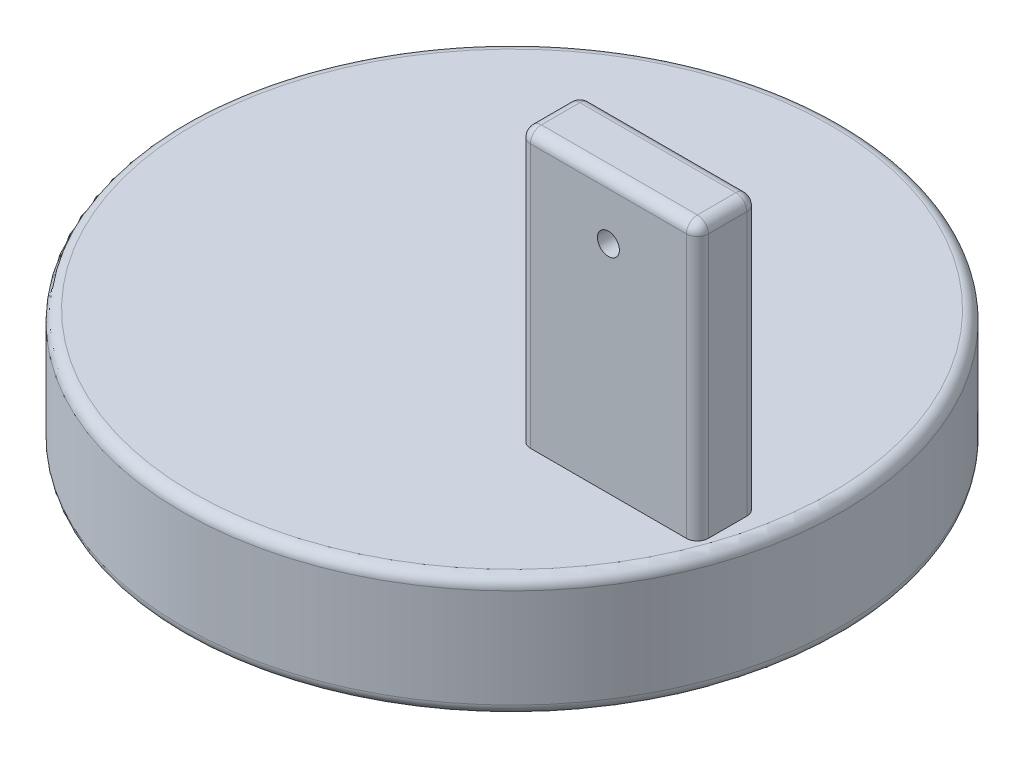
ISO-10303-21;
HEADER;
FILE_DESCRIPTION(('STEP AP214'),'2;1');
FILE_NAME('part.step','',(''),(''),'','','');
FILE_SCHEMA(('AUTOMOTIVE_DESIGN { 1 0 10303 214 1 1 1 1 }'));
ENDSEC;
DATA;
#1=APPLICATION_CONTEXT('core data for automotive mechanical design processes');
#2=APPLICATION_PROTOCOL_DEFINITION('international standard','automotive_design',2000,#1);
#3=PRODUCT_CONTEXT('',#1,'mechanical');
#4=PRODUCT('Part','Part','',(#3));
#5=PRODUCT_RELATED_PRODUCT_CATEGORY('part','',(#4));
#6=PRODUCT_DEFINITION_FORMATION('','',#4);
#7=PRODUCT_DEFINITION_CONTEXT('part definition',#1,'design');
#8=PRODUCT_DEFINITION('design','',#6,#7);
#9=PRODUCT_DEFINITION_SHAPE('','',#8);
#10=(LENGTH_UNIT() NAMED_UNIT(*) SI_UNIT(.MILLI.,.METRE.));
#11=(NAMED_UNIT(*) PLANE_ANGLE_UNIT() SI_UNIT($,.RADIAN.));
#12=(NAMED_UNIT(*) SI_UNIT($,.STERADIAN.) SOLID_ANGLE_UNIT());
#13=UNCERTAINTY_MEASURE_WITH_UNIT(LENGTH_MEASURE(1.E-05),#10,'distance_accuracy_value','');
#14=(GEOMETRIC_REPRESENTATION_CONTEXT(3) GLOBAL_UNCERTAINTY_ASSIGNED_CONTEXT((#13)) GLOBAL_UNIT_ASSIGNED_CONTEXT((#10,
#11,#12)) REPRESENTATION_CONTEXT('',''));
#15=CARTESIAN_POINT('',(0.,0.,0.));
#16=DIRECTION('',(0.,0.,1.));
#17=DIRECTION('',(1.,0.,0.));
#18=AXIS2_PLACEMENT_3D('',#15,#16,#17);
#19=CARTESIAN_POINT('',(0.,11.,0.));
#20=DIRECTION('',(0.,1.,0.));
#21=DIRECTION('',(0.,0.,1.));
#22=AXIS2_PLACEMENT_3D('',#19,#20,#21);
#23=PLANE('',#22);
#24=CARTESIAN_POINT('',(0.,11.,0.));
#25=DIRECTION('',(0.,1.,0.));
#26=DIRECTION('',(0.,0.,1.));
#27=AXIS2_PLACEMENT_3D('',#24,#25,#26);
#28=CIRCLE('',#27,29.);
#29=CARTESIAN_POINT('',(0.,11.,29.));
#30=VERTEX_POINT('',#29);
#31=EDGE_CURVE('E225',#30,#30,#28,.T.);
#32=ORIENTED_EDGE('',*,*,#31,.T.);
#33=EDGE_LOOP('',(#32));
#34=FACE_BOUND('',#33,.T.);
#35=DIRECTION('',(0.,0.,-1.));
#36=VECTOR('',#35,1.);
#37=CARTESIAN_POINT('',(10.8,11.,10.13));
#38=LINE('',#37,#36);
#39=CARTESIAN_POINT('',(10.8,11.,9.13));
#40=VERTEX_POINT('',#39);
#41=CARTESIAN_POINT('',(10.8,11.,5.63));
#42=VERTEX_POINT('',#41);
#43=EDGE_CURVE('E121',#40,#42,#38,.T.);
#44=ORIENTED_EDGE('',*,*,#43,.T.);
#45=CARTESIAN_POINT('',(11.8,11.,5.63));
#46=DIRECTION('',(0.,1.,0.));
#47=DIRECTION('',(0.,0.,1.));
#48=AXIS2_PLACEMENT_3D('',#45,#46,#47);
#49=CIRCLE('',#48,1.);
#50=CARTESIAN_POINT('',(11.8,11.,4.63));
#51=VERTEX_POINT('',#50);
#52=EDGE_CURVE('E116',#42,#51,#49,.F.);
#53=ORIENTED_EDGE('',*,*,#52,.T.);
#54=DIRECTION('',(1.,0.,0.));
#55=VECTOR('',#54,1.);
#56=CARTESIAN_POINT('',(27.,11.,4.63));
#57=LINE('',#56,#55);
#58=CARTESIAN_POINT('',(26.,11.,4.63));
#59=VERTEX_POINT('',#58);
#60=EDGE_CURVE('E118',#51,#59,#57,.T.);
#61=ORIENTED_EDGE('',*,*,#60,.T.);
#62=CARTESIAN_POINT('',(26.,11.,5.63));
#63=DIRECTION('',(0.,1.,0.));
#64=DIRECTION('',(0.,0.,1.));
#65=AXIS2_PLACEMENT_3D('',#62,#63,#64);
#66=CIRCLE('',#65,1.);
#67=CARTESIAN_POINT('',(27.,11.,5.63));
#68=VERTEX_POINT('',#67);
#69=EDGE_CURVE('E126',#59,#68,#66,.F.);
#70=ORIENTED_EDGE('',*,*,#69,.T.);
#71=DIRECTION('',(0.,0.,-1.));
#72=VECTOR('',#71,1.);
#73=CARTESIAN_POINT('',(27.,11.,10.13));
#74=LINE('',#73,#72);
#75=CARTESIAN_POINT('',(27.,11.,9.13));
#76=VERTEX_POINT('',#75);
#77=EDGE_CURVE('E213',#76,#68,#74,.T.);
#78=ORIENTED_EDGE('',*,*,#77,.F.);
#79=CARTESIAN_POINT('',(26.,11.,9.13));
#80=DIRECTION('',(0.,1.,0.));
#81=DIRECTION('',(0.,0.,1.));
#82=AXIS2_PLACEMENT_3D('',#79,#80,#81);
#83=CIRCLE('',#82,1.);
#84=CARTESIAN_POINT('',(26.,11.,10.13));
#85=VERTEX_POINT('',#84);
#86=EDGE_CURVE('E11',#76,#85,#83,.F.);
#87=ORIENTED_EDGE('',*,*,#86,.T.);
#88=DIRECTION('',(1.,0.,0.));
#89=VECTOR('',#88,1.);
#90=CARTESIAN_POINT('',(27.,11.,10.13));
#91=LINE('',#90,#89);
#92=CARTESIAN_POINT('',(11.8,11.,10.13));
#93=VERTEX_POINT('',#92);
#94=EDGE_CURVE('E135',#93,#85,#91,.T.);
#95=ORIENTED_EDGE('',*,*,#94,.F.);
#96=CARTESIAN_POINT('',(11.8,11.,9.13));
#97=DIRECTION('',(0.,1.,0.));
#98=DIRECTION('',(0.,0.,1.));
#99=AXIS2_PLACEMENT_3D('',#96,#97,#98);
#100=CIRCLE('',#99,1.);
#101=EDGE_CURVE('E44',#93,#40,#100,.F.);
#102=ORIENTED_EDGE('',*,*,#101,.T.);
#103=EDGE_LOOP('',(#44,#53,#61,#70,#78,#87,#95,#102));
#104=FACE_BOUND('',#103,.T.);
#105=ADVANCED_FACE('F35',(#34,#104),#23,.T.);
#106=CARTESIAN_POINT('',(0.,11.,0.));
#107=DIRECTION('',(0.,-1.,0.));
#108=DIRECTION('',(0.,0.,-1.));
#109=AXIS2_PLACEMENT_3D('',#106,#107,#108);
#110=CYLINDRICAL_SURFACE('',#109,30.);
#111=CARTESIAN_POINT('',(0.,1.,0.));
#112=DIRECTION('',(0.,1.,0.));
#113=DIRECTION('',(0.,0.,1.));
#114=AXIS2_PLACEMENT_3D('',#111,#112,#113);
#115=CIRCLE('',#114,30.);
#116=CARTESIAN_POINT('',(0.,1.,30.));
#117=VERTEX_POINT('',#116);
#118=EDGE_CURVE('E219',#117,#117,#115,.T.);
#119=ORIENTED_EDGE('',*,*,#118,.T.);
#120=EDGE_LOOP('',(#119));
#121=FACE_BOUND('',#120,.T.);
#122=CARTESIAN_POINT('',(0.,10.,0.));
#123=DIRECTION('',(0.,1.,0.));
#124=DIRECTION('',(0.,0.,1.));
#125=AXIS2_PLACEMENT_3D('',#122,#123,#124);
#126=CIRCLE('',#125,30.);
#127=CARTESIAN_POINT('',(0.,10.,30.));
#128=VERTEX_POINT('',#127);
#129=EDGE_CURVE('E216',#128,#128,#126,.F.);
#130=ORIENTED_EDGE('',*,*,#129,.T.);
#131=EDGE_LOOP('',(#130));
#132=FACE_BOUND('',#131,.T.);
#133=ADVANCED_FACE('F288',(#121,#132),#110,.T.);
#134=CARTESIAN_POINT('',(0.,0.,0.));
#135=DIRECTION('',(0.,1.,0.));
#136=DIRECTION('',(0.,0.,1.));
#137=AXIS2_PLACEMENT_3D('',#134,#135,#136);
#138=PLANE('',#137);
#139=CARTESIAN_POINT('',(0.,0.,13.));
#140=DIRECTION('',(0.,-1.,0.));
#141=DIRECTION('',(0.,0.,-1.));
#142=AXIS2_PLACEMENT_3D('',#139,#140,#141);
#143=CIRCLE('',#142,1.3);
#144=CARTESIAN_POINT('',(0.,0.,11.7));
#145=VERTEX_POINT('',#144);
#146=EDGE_CURVE('E432',#145,#145,#143,.T.);
#147=ORIENTED_EDGE('',*,*,#146,.F.);
#148=EDGE_LOOP('',(#147));
#149=FACE_BOUND('',#148,.T.);
#150=CARTESIAN_POINT('',(13.,0.,0.));
#151=DIRECTION('',(0.,-1.,0.));
#152=DIRECTION('',(0.,0.,-1.));
#153=AXIS2_PLACEMENT_3D('',#150,#151,#152);
#154=CIRCLE('',#153,1.3);
#155=CARTESIAN_POINT('',(13.,0.,-1.30000000000005));
#156=VERTEX_POINT('',#155);
#157=EDGE_CURVE('E440',#156,#156,#154,.T.);
#158=ORIENTED_EDGE('',*,*,#157,.F.);
#159=EDGE_LOOP('',(#158));
#160=FACE_BOUND('',#159,.T.);
#161=CARTESIAN_POINT('',(0.,0.,-13.));
#162=DIRECTION('',(0.,-1.,0.));
#163=DIRECTION('',(0.,0.,-1.));
#164=AXIS2_PLACEMENT_3D('',#161,#162,#163);
#165=CIRCLE('',#164,1.3);
#166=CARTESIAN_POINT('',(0.,0.,-14.3));
#167=VERTEX_POINT('',#166);
#168=EDGE_CURVE('E446',#167,#167,#165,.T.);
#169=ORIENTED_EDGE('',*,*,#168,.F.);
#170=EDGE_LOOP('',(#169));
#171=FACE_BOUND('',#170,.T.);
#172=CARTESIAN_POINT('',(-13.,0.,1.36167772214882E-13));
#173=DIRECTION('',(0.,-1.,0.));
#174=DIRECTION('',(0.,0.,-1.));
#175=AXIS2_PLACEMENT_3D('',#172,#173,#174);
#176=CIRCLE('',#175,1.3);
#177=CARTESIAN_POINT('',(-13.,0.,-1.29999999999986));
#178=VERTEX_POINT('',#177);
#179=EDGE_CURVE('E451',#178,#178,#176,.T.);
#180=ORIENTED_EDGE('',*,*,#179,.F.);
#181=EDGE_LOOP('',(#180));
#182=FACE_BOUND('',#181,.T.);
#183=CARTESIAN_POINT('',(0.,0.,0.));
#184=DIRECTION('',(0.,1.,0.));
#185=DIRECTION('',(0.,0.,1.));
#186=AXIS2_PLACEMENT_3D('',#183,#184,#185);
#187=CIRCLE('',#186,29.);
#188=CARTESIAN_POINT('',(0.,0.,29.));
#189=VERTEX_POINT('',#188);
#190=EDGE_CURVE('E222',#189,#189,#187,.F.);
#191=ORIENTED_EDGE('',*,*,#190,.T.);
#192=EDGE_LOOP('',(#191));
#193=FACE_BOUND('',#192,.T.);
#194=ADVANCED_FACE('F294',(#149,#160,#171,#182,#193),#138,.F.);
#195=CARTESIAN_POINT('',(0.,0.,10.13));
#196=DIRECTION('',(0.,0.,1.));
#197=DIRECTION('',(1.,0.,0.));
#198=AXIS2_PLACEMENT_3D('',#195,#196,#197);
#199=PLANE('',#198);
#200=DIRECTION('',(-1.,0.,0.));
#201=VECTOR('',#200,1.);
#202=CARTESIAN_POINT('',(10.8,35.,10.13));
#203=LINE('',#202,#201);
#204=CARTESIAN_POINT('',(26.,35.,10.13));
#205=VERTEX_POINT('',#204);
#206=CARTESIAN_POINT('',(11.8,35.,10.13));
#207=VERTEX_POINT('',#206);
#208=EDGE_CURVE('E152',#205,#207,#203,.T.);
#209=ORIENTED_EDGE('',*,*,#208,.T.);
#210=DIRECTION('',(0.,-1.,0.));
#211=VECTOR('',#210,1.);
#212=CARTESIAN_POINT('',(11.8,11.,10.13));
#213=LINE('',#212,#211);
#214=EDGE_CURVE('E156',#207,#93,#213,.T.);
#215=ORIENTED_EDGE('',*,*,#214,.T.);
#216=ORIENTED_EDGE('',*,*,#94,.T.);
#217=DIRECTION('',(0.,1.,0.));
#218=VECTOR('',#217,1.);
#219=CARTESIAN_POINT('',(26.,36.,10.13));
#220=LINE('',#219,#218);
#221=EDGE_CURVE('E154',#85,#205,#220,.T.);
#222=ORIENTED_EDGE('',*,*,#221,.T.);
#223=EDGE_LOOP('',(#209,#215,#216,#222));
#224=FACE_BOUND('',#223,.T.);
#225=CARTESIAN_POINT('',(18.9,30.67,10.13));
#226=DIRECTION('',(0.,0.,1.));
#227=DIRECTION('',(1.,0.,0.));
#228=AXIS2_PLACEMENT_3D('',#225,#226,#227);
#229=CIRCLE('',#228,1.);
#230=CARTESIAN_POINT('',(19.9,30.67,10.13));
#231=VERTEX_POINT('',#230);
#232=EDGE_CURVE('E136',#231,#231,#229,.T.);
#233=ORIENTED_EDGE('',*,*,#232,.F.);
#234=EDGE_LOOP('',(#233));
#235=FACE_BOUND('',#234,.T.);
#236=ADVANCED_FACE('F256',(#224,#235),#199,.T.);
#237=CARTESIAN_POINT('',(0.,0.,4.63));
#238=DIRECTION('',(0.,0.,1.));
#239=DIRECTION('',(1.,0.,0.));
#240=AXIS2_PLACEMENT_3D('',#237,#238,#239);
#241=PLANE('',#240);
#242=ORIENTED_EDGE('',*,*,#60,.F.);
#243=DIRECTION('',(0.,-1.,0.));
#244=VECTOR('',#243,1.);
#245=CARTESIAN_POINT('',(11.8,0.,4.63));
#246=LINE('',#245,#244);
#247=CARTESIAN_POINT('',(11.8,35.,4.63));
#248=VERTEX_POINT('',#247);
#249=EDGE_CURVE('E131',#51,#248,#246,.F.);
#250=ORIENTED_EDGE('',*,*,#249,.T.);
#251=DIRECTION('',(-1.,0.,0.));
#252=VECTOR('',#251,1.);
#253=CARTESIAN_POINT('',(0.,35.,4.63));
#254=LINE('',#253,#252);
#255=CARTESIAN_POINT('',(26.,35.,4.63));
#256=VERTEX_POINT('',#255);
#257=EDGE_CURVE('E145',#248,#256,#254,.F.);
#258=ORIENTED_EDGE('',*,*,#257,.T.);
#259=DIRECTION('',(0.,1.,0.));
#260=VECTOR('',#259,1.);
#261=CARTESIAN_POINT('',(26.,0.,4.63));
#262=LINE('',#261,#260);
#263=EDGE_CURVE('E134',#256,#59,#262,.F.);
#264=ORIENTED_EDGE('',*,*,#263,.T.);
#265=EDGE_LOOP('',(#242,#250,#258,#264));
#266=FACE_BOUND('',#265,.T.);
#267=CARTESIAN_POINT('',(18.9,30.67,4.63));
#268=DIRECTION('',(0.,0.,1.));
#269=DIRECTION('',(1.,0.,0.));
#270=AXIS2_PLACEMENT_3D('',#267,#268,#269);
#271=CIRCLE('',#270,1.);
#272=CARTESIAN_POINT('',(19.9,30.67,4.63));
#273=VERTEX_POINT('',#272);
#274=EDGE_CURVE('E199',#273,#273,#271,.T.);
#275=ORIENTED_EDGE('',*,*,#274,.T.);
#276=EDGE_LOOP('',(#275));
#277=FACE_BOUND('',#276,.T.);
#278=ADVANCED_FACE('F129',(#266,#277),#241,.F.);
#279=CARTESIAN_POINT('',(27.,11.,10.13));
#280=DIRECTION('',(-1.,0.,0.));
#281=DIRECTION('',(0.,-1.,0.));
#282=AXIS2_PLACEMENT_3D('',#279,#280,#281);
#283=PLANE('',#282);
#284=ORIENTED_EDGE('',*,*,#77,.T.);
#285=DIRECTION('',(0.,1.,0.));
#286=VECTOR('',#285,1.);
#287=CARTESIAN_POINT('',(27.,11.,5.63));
#288=LINE('',#287,#286);
#289=CARTESIAN_POINT('',(27.,35.,5.63));
#290=VERTEX_POINT('',#289);
#291=EDGE_CURVE('E150',#68,#290,#288,.T.);
#292=ORIENTED_EDGE('',*,*,#291,.T.);
#293=DIRECTION('',(0.,0.,-1.));
#294=VECTOR('',#293,1.);
#295=CARTESIAN_POINT('',(27.,35.,10.13));
#296=LINE('',#295,#294);
#297=CARTESIAN_POINT('',(27.,35.,9.13));
#298=VERTEX_POINT('',#297);
#299=EDGE_CURVE('E141',#290,#298,#296,.F.);
#300=ORIENTED_EDGE('',*,*,#299,.T.);
#301=DIRECTION('',(0.,1.,0.));
#302=VECTOR('',#301,1.);
#303=CARTESIAN_POINT('',(27.,11.,9.13));
#304=LINE('',#303,#302);
#305=EDGE_CURVE('E143',#298,#76,#304,.F.);
#306=ORIENTED_EDGE('',*,*,#305,.T.);
#307=EDGE_LOOP('',(#284,#292,#300,#306));
#308=FACE_BOUND('',#307,.T.);
#309=ADVANCED_FACE('F248',(#308),#283,.F.);
#310=CARTESIAN_POINT('',(27.,36.,10.13));
#311=DIRECTION('',(0.,-1.,0.));
#312=DIRECTION('',(0.,0.,-1.));
#313=AXIS2_PLACEMENT_3D('',#310,#311,#312);
#314=PLANE('',#313);
#315=DIRECTION('',(-1.,0.,0.));
#316=VECTOR('',#315,1.);
#317=CARTESIAN_POINT('',(27.,36.,5.63));
#318=LINE('',#317,#316);
#319=CARTESIAN_POINT('',(26.,36.,5.63));
#320=VERTEX_POINT('',#319);
#321=CARTESIAN_POINT('',(11.8,36.,5.63));
#322=VERTEX_POINT('',#321);
#323=EDGE_CURVE('E162',#320,#322,#318,.T.);
#324=ORIENTED_EDGE('',*,*,#323,.T.);
#325=DIRECTION('',(0.,0.,-1.));
#326=VECTOR('',#325,1.);
#327=CARTESIAN_POINT('',(11.8,36.,10.13));
#328=LINE('',#327,#326);
#329=CARTESIAN_POINT('',(11.8,36.,9.13));
#330=VERTEX_POINT('',#329);
#331=EDGE_CURVE('E60',#322,#330,#328,.F.);
#332=ORIENTED_EDGE('',*,*,#331,.T.);
#333=DIRECTION('',(-1.,0.,0.));
#334=VECTOR('',#333,1.);
#335=CARTESIAN_POINT('',(27.,36.,9.13));
#336=LINE('',#335,#334);
#337=CARTESIAN_POINT('',(26.,36.,9.13));
#338=VERTEX_POINT('',#337);
#339=EDGE_CURVE('E160',#330,#338,#336,.F.);
#340=ORIENTED_EDGE('',*,*,#339,.T.);
#341=DIRECTION('',(0.,0.,-1.));
#342=VECTOR('',#341,1.);
#343=CARTESIAN_POINT('',(26.,36.,10.13));
#344=LINE('',#343,#342);
#345=EDGE_CURVE('E158',#338,#320,#344,.T.);
#346=ORIENTED_EDGE('',*,*,#345,.T.);
#347=EDGE_LOOP('',(#324,#332,#340,#346));
#348=FACE_BOUND('',#347,.T.);
#349=ADVANCED_FACE('F244',(#348),#314,.F.);
#350=CARTESIAN_POINT('',(10.8,36.,10.13));
#351=DIRECTION('',(1.,0.,0.));
#352=DIRECTION('',(0.,1.,0.));
#353=AXIS2_PLACEMENT_3D('',#350,#351,#352);
#354=PLANE('',#353);
#355=DIRECTION('',(0.,0.,-1.));
#356=VECTOR('',#355,1.);
#357=CARTESIAN_POINT('',(10.8,35.,10.13));
#358=LINE('',#357,#356);
#359=CARTESIAN_POINT('',(10.8,35.,9.13));
#360=VERTEX_POINT('',#359);
#361=CARTESIAN_POINT('',(10.8,35.,5.63));
#362=VERTEX_POINT('',#361);
#363=EDGE_CURVE('E228',#360,#362,#358,.T.);
#364=ORIENTED_EDGE('',*,*,#363,.T.);
#365=DIRECTION('',(0.,-1.,0.));
#366=VECTOR('',#365,1.);
#367=CARTESIAN_POINT('',(10.8,36.,5.63));
#368=LINE('',#367,#366);
#369=EDGE_CURVE('E232',#362,#42,#368,.T.);
#370=ORIENTED_EDGE('',*,*,#369,.T.);
#371=ORIENTED_EDGE('',*,*,#43,.F.);
#372=DIRECTION('',(0.,-1.,0.));
#373=VECTOR('',#372,1.);
#374=CARTESIAN_POINT('',(10.8,36.,9.13));
#375=LINE('',#374,#373);
#376=EDGE_CURVE('E230',#40,#360,#375,.F.);
#377=ORIENTED_EDGE('',*,*,#376,.T.);
#378=EDGE_LOOP('',(#364,#370,#371,#377));
#379=FACE_BOUND('',#378,.T.);
#380=ADVANCED_FACE('F274',(#379),#354,.F.);
#381=CARTESIAN_POINT('',(18.9,30.67,10.13));
#382=DIRECTION('',(0.,0.,-1.));
#383=DIRECTION('',(-1.,0.,0.));
#384=AXIS2_PLACEMENT_3D('',#381,#382,#383);
#385=CYLINDRICAL_SURFACE('',#384,1.);
#386=ORIENTED_EDGE('',*,*,#232,.T.);
#387=EDGE_LOOP('',(#386));
#388=FACE_BOUND('',#387,.T.);
#389=ORIENTED_EDGE('',*,*,#274,.F.);
#390=EDGE_LOOP('',(#389));
#391=FACE_BOUND('',#390,.T.);
#392=ADVANCED_FACE('F276',(#388,#391),#385,.F.);
#393=CARTESIAN_POINT('',(0.,1.,0.));
#394=DIRECTION('',(0.,1.,0.));
#395=DIRECTION('',(0.,0.,1.));
#396=AXIS2_PLACEMENT_3D('',#393,#394,#395);
#397=TOROIDAL_SURFACE('',#396,29.,1.);
#398=ORIENTED_EDGE('',*,*,#190,.F.);
#399=EDGE_LOOP('',(#398));
#400=FACE_BOUND('',#399,.T.);
#401=ORIENTED_EDGE('',*,*,#118,.F.);
#402=EDGE_LOOP('',(#401));
#403=FACE_BOUND('',#402,.T.);
#404=ADVANCED_FACE('F282',(#400,#403),#397,.T.);
#405=CARTESIAN_POINT('',(0.,10.,0.));
#406=DIRECTION('',(0.,1.,0.));
#407=DIRECTION('',(0.,0.,1.));
#408=AXIS2_PLACEMENT_3D('',#405,#406,#407);
#409=TOROIDAL_SURFACE('',#408,29.,1.);
#410=ORIENTED_EDGE('',*,*,#129,.F.);
#411=EDGE_LOOP('',(#410));
#412=FACE_BOUND('',#411,.T.);
#413=ORIENTED_EDGE('',*,*,#31,.F.);
#414=EDGE_LOOP('',(#413));
#415=FACE_BOUND('',#414,.T.);
#416=ADVANCED_FACE('F304',(#412,#415),#409,.T.);
#417=CARTESIAN_POINT('',(26.,0.,9.13));
#418=DIRECTION('',(0.,-1.,0.));
#419=DIRECTION('',(1.,0.,0.));
#420=AXIS2_PLACEMENT_3D('',#417,#418,#419);
#421=CYLINDRICAL_SURFACE('',#420,1.);
#422=CARTESIAN_POINT('',(26.,35.,9.13));
#423=DIRECTION('',(0.,1.,0.));
#424=DIRECTION('',(0.,0.,1.));
#425=AXIS2_PLACEMENT_3D('',#422,#423,#424);
#426=CIRCLE('',#425,1.);
#427=EDGE_CURVE('E39',#205,#298,#426,.T.);
#428=ORIENTED_EDGE('',*,*,#427,.F.);
#429=ORIENTED_EDGE('',*,*,#221,.F.);
#430=ORIENTED_EDGE('',*,*,#86,.F.);
#431=ORIENTED_EDGE('',*,*,#305,.F.);
#432=EDGE_LOOP('',(#428,#429,#430,#431));
#433=FACE_BOUND('',#432,.T.);
#434=ADVANCED_FACE('F37',(#433),#421,.T.);
#435=CARTESIAN_POINT('',(26.,35.,9.13));
#436=DIRECTION('',(1.,0.,0.));
#437=DIRECTION('',(0.,0.,-1.));
#438=AXIS2_PLACEMENT_3D('',#435,#436,#437);
#439=SPHERICAL_SURFACE('',#438,1.);
#440=CARTESIAN_POINT('',(26.,35.,9.13));
#441=DIRECTION('',(1.,0.,0.));
#442=DIRECTION('',(0.,0.,-1.));
#443=AXIS2_PLACEMENT_3D('',#440,#441,#442);
#444=CIRCLE('',#443,1.);
#445=EDGE_CURVE('E190',#205,#338,#444,.F.);
#446=ORIENTED_EDGE('',*,*,#445,.F.);
#447=ORIENTED_EDGE('',*,*,#427,.T.);
#448=CARTESIAN_POINT('',(26.,35.,9.13));
#449=DIRECTION('',(0.,0.,1.));
#450=DIRECTION('',(1.,0.,0.));
#451=AXIS2_PLACEMENT_3D('',#448,#449,#450);
#452=CIRCLE('',#451,1.);
#453=EDGE_CURVE('E192',#338,#298,#452,.F.);
#454=ORIENTED_EDGE('',*,*,#453,.F.);
#455=EDGE_LOOP('',(#446,#447,#454));
#456=FACE_BOUND('',#455,.T.);
#457=ADVANCED_FACE('F330',(#456),#439,.T.);
#458=CARTESIAN_POINT('',(26.,11.,5.63));
#459=DIRECTION('',(0.,1.,0.));
#460=DIRECTION('',(-1.,0.,0.));
#461=AXIS2_PLACEMENT_3D('',#458,#459,#460);
#462=CYLINDRICAL_SURFACE('',#461,1.);
#463=ORIENTED_EDGE('',*,*,#69,.F.);
#464=ORIENTED_EDGE('',*,*,#263,.F.);
#465=CARTESIAN_POINT('',(26.,35.,5.63));
#466=DIRECTION('',(0.,1.,0.));
#467=DIRECTION('',(0.,0.,1.));
#468=AXIS2_PLACEMENT_3D('',#465,#466,#467);
#469=CIRCLE('',#468,1.);
#470=EDGE_CURVE('E187',#290,#256,#469,.T.);
#471=ORIENTED_EDGE('',*,*,#470,.F.);
#472=ORIENTED_EDGE('',*,*,#291,.F.);
#473=EDGE_LOOP('',(#463,#464,#471,#472));
#474=FACE_BOUND('',#473,.T.);
#475=ADVANCED_FACE('F236',(#474),#462,.T.);
#476=CARTESIAN_POINT('',(26.,35.,10.13));
#477=DIRECTION('',(0.,0.,-1.));
#478=DIRECTION('',(-1.,0.,0.));
#479=AXIS2_PLACEMENT_3D('',#476,#477,#478);
#480=CYLINDRICAL_SURFACE('',#479,1.);
#481=ORIENTED_EDGE('',*,*,#453,.T.);
#482=ORIENTED_EDGE('',*,*,#299,.F.);
#483=CARTESIAN_POINT('',(26.,35.,5.63));
#484=DIRECTION('',(0.,0.,-1.));
#485=DIRECTION('',(-1.,0.,0.));
#486=AXIS2_PLACEMENT_3D('',#483,#484,#485);
#487=CIRCLE('',#486,1.);
#488=EDGE_CURVE('E184',#320,#290,#487,.T.);
#489=ORIENTED_EDGE('',*,*,#488,.F.);
#490=ORIENTED_EDGE('',*,*,#345,.F.);
#491=EDGE_LOOP('',(#481,#482,#489,#490));
#492=FACE_BOUND('',#491,.T.);
#493=ADVANCED_FACE('F245',(#492),#480,.T.);
#494=CARTESIAN_POINT('',(0.,35.,9.13));
#495=DIRECTION('',(1.,0.,0.));
#496=DIRECTION('',(0.,0.,-1.));
#497=AXIS2_PLACEMENT_3D('',#494,#495,#496);
#498=CYLINDRICAL_SURFACE('',#497,1.);
#499=ORIENTED_EDGE('',*,*,#445,.T.);
#500=ORIENTED_EDGE('',*,*,#339,.F.);
#501=CARTESIAN_POINT('',(11.8,35.,9.13));
#502=DIRECTION('',(-1.,0.,0.));
#503=DIRECTION('',(0.,0.,1.));
#504=AXIS2_PLACEMENT_3D('',#501,#502,#503);
#505=CIRCLE('',#504,1.);
#506=EDGE_CURVE('E181',#207,#330,#505,.T.);
#507=ORIENTED_EDGE('',*,*,#506,.F.);
#508=ORIENTED_EDGE('',*,*,#208,.F.);
#509=EDGE_LOOP('',(#499,#500,#507,#508));
#510=FACE_BOUND('',#509,.T.);
#511=ADVANCED_FACE('F267',(#510),#498,.T.);
#512=CARTESIAN_POINT('',(11.8,0.,9.13));
#513=DIRECTION('',(0.,1.,0.));
#514=DIRECTION('',(-1.,0.,0.));
#515=AXIS2_PLACEMENT_3D('',#512,#513,#514);
#516=CYLINDRICAL_SURFACE('',#515,1.);
#517=ORIENTED_EDGE('',*,*,#101,.F.);
#518=ORIENTED_EDGE('',*,*,#214,.F.);
#519=CARTESIAN_POINT('',(11.8,35.,9.13));
#520=DIRECTION('',(0.,1.,0.));
#521=DIRECTION('',(0.,0.,1.));
#522=AXIS2_PLACEMENT_3D('',#519,#520,#521);
#523=CIRCLE('',#522,1.);
#524=EDGE_CURVE('E178',#360,#207,#523,.T.);
#525=ORIENTED_EDGE('',*,*,#524,.F.);
#526=ORIENTED_EDGE('',*,*,#376,.F.);
#527=EDGE_LOOP('',(#517,#518,#525,#526));
#528=FACE_BOUND('',#527,.T.);
#529=ADVANCED_FACE('F263',(#528),#516,.T.);
#530=CARTESIAN_POINT('',(26.,35.,5.63));
#531=DIRECTION('',(1.,0.,0.));
#532=DIRECTION('',(0.,0.,-1.));
#533=AXIS2_PLACEMENT_3D('',#530,#531,#532);
#534=SPHERICAL_SURFACE('',#533,1.);
#535=ORIENTED_EDGE('',*,*,#488,.T.);
#536=ORIENTED_EDGE('',*,*,#470,.T.);
#537=CARTESIAN_POINT('',(26.,35.,5.63));
#538=DIRECTION('',(1.,0.,0.));
#539=DIRECTION('',(0.,0.,-1.));
#540=AXIS2_PLACEMENT_3D('',#537,#538,#539);
#541=CIRCLE('',#540,1.);
#542=EDGE_CURVE('E175',#320,#256,#541,.F.);
#543=ORIENTED_EDGE('',*,*,#542,.F.);
#544=EDGE_LOOP('',(#535,#536,#543));
#545=FACE_BOUND('',#544,.T.);
#546=ADVANCED_FACE('F240',(#545),#534,.T.);
#547=CARTESIAN_POINT('',(11.8,35.,9.13));
#548=DIRECTION('',(0.,0.,1.));
#549=DIRECTION('',(1.,0.,0.));
#550=AXIS2_PLACEMENT_3D('',#547,#548,#549);
#551=SPHERICAL_SURFACE('',#550,1.);
#552=ORIENTED_EDGE('',*,*,#524,.T.);
#553=ORIENTED_EDGE('',*,*,#506,.T.);
#554=CARTESIAN_POINT('',(11.8,35.,9.13));
#555=DIRECTION('',(0.,0.,1.));
#556=DIRECTION('',(1.,0.,0.));
#557=AXIS2_PLACEMENT_3D('',#554,#555,#556);
#558=CIRCLE('',#557,1.);
#559=EDGE_CURVE('E172',#360,#330,#558,.F.);
#560=ORIENTED_EDGE('',*,*,#559,.F.);
#561=EDGE_LOOP('',(#552,#553,#560));
#562=FACE_BOUND('',#561,.T.);
#563=ADVANCED_FACE('F269',(#562),#551,.T.);
#564=CARTESIAN_POINT('',(27.,35.,5.63));
#565=DIRECTION('',(-1.,0.,0.));
#566=DIRECTION('',(0.,0.,1.));
#567=AXIS2_PLACEMENT_3D('',#564,#565,#566);
#568=CYLINDRICAL_SURFACE('',#567,1.);
#569=ORIENTED_EDGE('',*,*,#542,.T.);
#570=ORIENTED_EDGE('',*,*,#257,.F.);
#571=CARTESIAN_POINT('',(11.8,35.,5.63));
#572=DIRECTION('',(-1.,0.,0.));
#573=DIRECTION('',(0.,0.,1.));
#574=AXIS2_PLACEMENT_3D('',#571,#572,#573);
#575=CIRCLE('',#574,1.);
#576=EDGE_CURVE('E170',#322,#248,#575,.T.);
#577=ORIENTED_EDGE('',*,*,#576,.F.);
#578=ORIENTED_EDGE('',*,*,#323,.F.);
#579=EDGE_LOOP('',(#569,#570,#577,#578));
#580=FACE_BOUND('',#579,.T.);
#581=ADVANCED_FACE('F243',(#580),#568,.T.);
#582=CARTESIAN_POINT('',(11.8,35.,10.13));
#583=DIRECTION('',(0.,0.,-1.));
#584=DIRECTION('',(-1.,0.,0.));
#585=AXIS2_PLACEMENT_3D('',#582,#583,#584);
#586=CYLINDRICAL_SURFACE('',#585,1.);
#587=ORIENTED_EDGE('',*,*,#559,.T.);
#588=ORIENTED_EDGE('',*,*,#331,.F.);
#589=CARTESIAN_POINT('',(11.8,35.,5.63));
#590=DIRECTION('',(0.,0.,-1.));
#591=DIRECTION('',(-1.,0.,0.));
#592=AXIS2_PLACEMENT_3D('',#589,#590,#591);
#593=CIRCLE('',#592,1.);
#594=EDGE_CURVE('E52',#362,#322,#593,.T.);
#595=ORIENTED_EDGE('',*,*,#594,.F.);
#596=ORIENTED_EDGE('',*,*,#363,.F.);
#597=EDGE_LOOP('',(#587,#588,#595,#596));
#598=FACE_BOUND('',#597,.T.);
#599=ADVANCED_FACE('F272',(#598),#586,.T.);
#600=CARTESIAN_POINT('',(11.8,35.,5.63));
#601=DIRECTION('',(0.,1.,0.));
#602=DIRECTION('',(0.,0.,1.));
#603=AXIS2_PLACEMENT_3D('',#600,#601,#602);
#604=SPHERICAL_SURFACE('',#603,1.);
#605=ORIENTED_EDGE('',*,*,#594,.T.);
#606=ORIENTED_EDGE('',*,*,#576,.T.);
#607=CARTESIAN_POINT('',(11.8,35.,5.63));
#608=DIRECTION('',(0.,1.,0.));
#609=DIRECTION('',(0.,0.,1.));
#610=AXIS2_PLACEMENT_3D('',#607,#608,#609);
#611=CIRCLE('',#610,1.);
#612=EDGE_CURVE('E140',#362,#248,#611,.F.);
#613=ORIENTED_EDGE('',*,*,#612,.F.);
#614=EDGE_LOOP('',(#605,#606,#613));
#615=FACE_BOUND('',#614,.T.);
#616=ADVANCED_FACE('F312',(#615),#604,.T.);
#617=CARTESIAN_POINT('',(11.8,36.,5.63));
#618=DIRECTION('',(0.,-1.,0.));
#619=DIRECTION('',(1.,0.,0.));
#620=AXIS2_PLACEMENT_3D('',#617,#618,#619);
#621=CYLINDRICAL_SURFACE('',#620,1.);
#622=ORIENTED_EDGE('',*,*,#612,.T.);
#623=ORIENTED_EDGE('',*,*,#249,.F.);
#624=ORIENTED_EDGE('',*,*,#52,.F.);
#625=ORIENTED_EDGE('',*,*,#369,.F.);
#626=EDGE_LOOP('',(#622,#623,#624,#625));
#627=FACE_BOUND('',#626,.T.);
#628=ADVANCED_FACE('F139',(#627),#621,.T.);
#629=CARTESIAN_POINT('',(-13.,5.,1.36167772214882E-13));
#630=DIRECTION('',(0.,-1.,0.));
#631=DIRECTION('',(0.,0.,-1.));
#632=AXIS2_PLACEMENT_3D('',#629,#630,#631);
#633=CYLINDRICAL_SURFACE('',#632,1.3);
#634=CARTESIAN_POINT('',(-13.,5.,1.36167772214882E-13));
#635=DIRECTION('',(0.,-1.,0.));
#636=DIRECTION('',(0.,0.,-1.));
#637=AXIS2_PLACEMENT_3D('',#634,#635,#636);
#638=CIRCLE('',#637,1.3);
#639=CARTESIAN_POINT('',(-13.,5.,-1.29999999999986));
#640=VERTEX_POINT('',#639);
#641=EDGE_CURVE('E449',#640,#640,#638,.T.);
#642=ORIENTED_EDGE('',*,*,#641,.F.);
#643=EDGE_LOOP('',(#642));
#644=FACE_BOUND('',#643,.T.);
#645=ORIENTED_EDGE('',*,*,#179,.T.);
#646=EDGE_LOOP('',(#645));
#647=FACE_BOUND('',#646,.T.);
#648=ADVANCED_FACE('F311',(#644,#647),#633,.F.);
#649=CARTESIAN_POINT('',(-13.,5.,1.36167772214882E-13));
#650=DIRECTION('',(0.,-1.,0.));
#651=DIRECTION('',(0.,0.,-1.));
#652=AXIS2_PLACEMENT_3D('',#649,#650,#651);
#653=PLANE('',#652);
#654=ORIENTED_EDGE('',*,*,#641,.T.);
#655=EDGE_LOOP('',(#654));
#656=FACE_BOUND('',#655,.T.);
#657=ADVANCED_FACE('F400',(#656),#653,.T.);
#658=CARTESIAN_POINT('',(0.,5.,-13.));
#659=DIRECTION('',(0.,-1.,0.));
#660=DIRECTION('',(0.,0.,-1.));
#661=AXIS2_PLACEMENT_3D('',#658,#659,#660);
#662=CYLINDRICAL_SURFACE('',#661,1.3);
#663=CARTESIAN_POINT('',(0.,5.,-13.));
#664=DIRECTION('',(0.,-1.,0.));
#665=DIRECTION('',(0.,0.,-1.));
#666=AXIS2_PLACEMENT_3D('',#663,#664,#665);
#667=CIRCLE('',#666,1.3);
#668=CARTESIAN_POINT('',(0.,5.,-14.3));
#669=VERTEX_POINT('',#668);
#670=EDGE_CURVE('E443',#669,#669,#667,.T.);
#671=ORIENTED_EDGE('',*,*,#670,.F.);
#672=EDGE_LOOP('',(#671));
#673=FACE_BOUND('',#672,.T.);
#674=ORIENTED_EDGE('',*,*,#168,.T.);
#675=EDGE_LOOP('',(#674));
#676=FACE_BOUND('',#675,.T.);
#677=ADVANCED_FACE('F404',(#673,#676),#662,.F.);
#678=CARTESIAN_POINT('',(0.,5.,-13.));
#679=DIRECTION('',(0.,-1.,0.));
#680=DIRECTION('',(0.,0.,-1.));
#681=AXIS2_PLACEMENT_3D('',#678,#679,#680);
#682=PLANE('',#681);
#683=ORIENTED_EDGE('',*,*,#670,.T.);
#684=EDGE_LOOP('',(#683));
#685=FACE_BOUND('',#684,.T.);
#686=ADVANCED_FACE('F408',(#685),#682,.T.);
#687=CARTESIAN_POINT('',(13.,5.,0.));
#688=DIRECTION('',(0.,-1.,0.));
#689=DIRECTION('',(0.,0.,-1.));
#690=AXIS2_PLACEMENT_3D('',#687,#688,#689);
#691=CYLINDRICAL_SURFACE('',#690,1.3);
#692=CARTESIAN_POINT('',(13.,5.,0.));
#693=DIRECTION('',(0.,-1.,0.));
#694=DIRECTION('',(0.,0.,-1.));
#695=AXIS2_PLACEMENT_3D('',#692,#693,#694);
#696=CIRCLE('',#695,1.3);
#697=CARTESIAN_POINT('',(13.,5.,-1.30000000000005));
#698=VERTEX_POINT('',#697);
#699=EDGE_CURVE('E435',#698,#698,#696,.T.);
#700=ORIENTED_EDGE('',*,*,#699,.F.);
#701=EDGE_LOOP('',(#700));
#702=FACE_BOUND('',#701,.T.);
#703=ORIENTED_EDGE('',*,*,#157,.T.);
#704=EDGE_LOOP('',(#703));
#705=FACE_BOUND('',#704,.T.);
#706=ADVANCED_FACE('F412',(#702,#705),#691,.F.);
#707=CARTESIAN_POINT('',(13.,5.,0.));
#708=DIRECTION('',(0.,-1.,0.));
#709=DIRECTION('',(0.,0.,-1.));
#710=AXIS2_PLACEMENT_3D('',#707,#708,#709);
#711=PLANE('',#710);
#712=ORIENTED_EDGE('',*,*,#699,.T.);
#713=EDGE_LOOP('',(#712));
#714=FACE_BOUND('',#713,.T.);
#715=ADVANCED_FACE('F416',(#714),#711,.T.);
#716=CARTESIAN_POINT('',(0.,5.,13.));
#717=DIRECTION('',(0.,-1.,0.));
#718=DIRECTION('',(0.,0.,-1.));
#719=AXIS2_PLACEMENT_3D('',#716,#717,#718);
#720=CYLINDRICAL_SURFACE('',#719,1.3);
#721=CARTESIAN_POINT('',(0.,5.,13.));
#722=DIRECTION('',(0.,-1.,0.));
#723=DIRECTION('',(0.,0.,-1.));
#724=AXIS2_PLACEMENT_3D('',#721,#722,#723);
#725=CIRCLE('',#724,1.3);
#726=CARTESIAN_POINT('',(0.,5.,11.7));
#727=VERTEX_POINT('',#726);
#728=EDGE_CURVE('E168',#727,#727,#725,.T.);
#729=ORIENTED_EDGE('',*,*,#728,.F.);
#730=EDGE_LOOP('',(#729));
#731=FACE_BOUND('',#730,.T.);
#732=ORIENTED_EDGE('',*,*,#146,.T.);
#733=EDGE_LOOP('',(#732));
#734=FACE_BOUND('',#733,.T.);
#735=ADVANCED_FACE('F420',(#731,#734),#720,.F.);
#736=CARTESIAN_POINT('',(0.,5.,13.));
#737=DIRECTION('',(0.,-1.,0.));
#738=DIRECTION('',(0.,0.,-1.));
#739=AXIS2_PLACEMENT_3D('',#736,#737,#738);
#740=PLANE('',#739);
#741=ORIENTED_EDGE('',*,*,#728,.T.);
#742=EDGE_LOOP('',(#741));
#743=FACE_BOUND('',#742,.T.);
#744=ADVANCED_FACE('F424',(#743),#740,.T.);
#745=CLOSED_SHELL('',(#105,#133,#194,#236,#278,#309,#349,#380,#392,#404,#416,#434,#457,#475,
#493,#511,#529,#546,#563,#581,#599,#616,#628,#648,#657,#677,#686,#706,#715,#735,#744));
#746=MANIFOLD_SOLID_BREP('B2',#745);
#747=ADVANCED_BREP_SHAPE_REPRESENTATION('',(#18,#746),#14);
#748=SHAPE_DEFINITION_REPRESENTATION(#9,#747);
ENDSEC;
END-ISO-10303-21;
